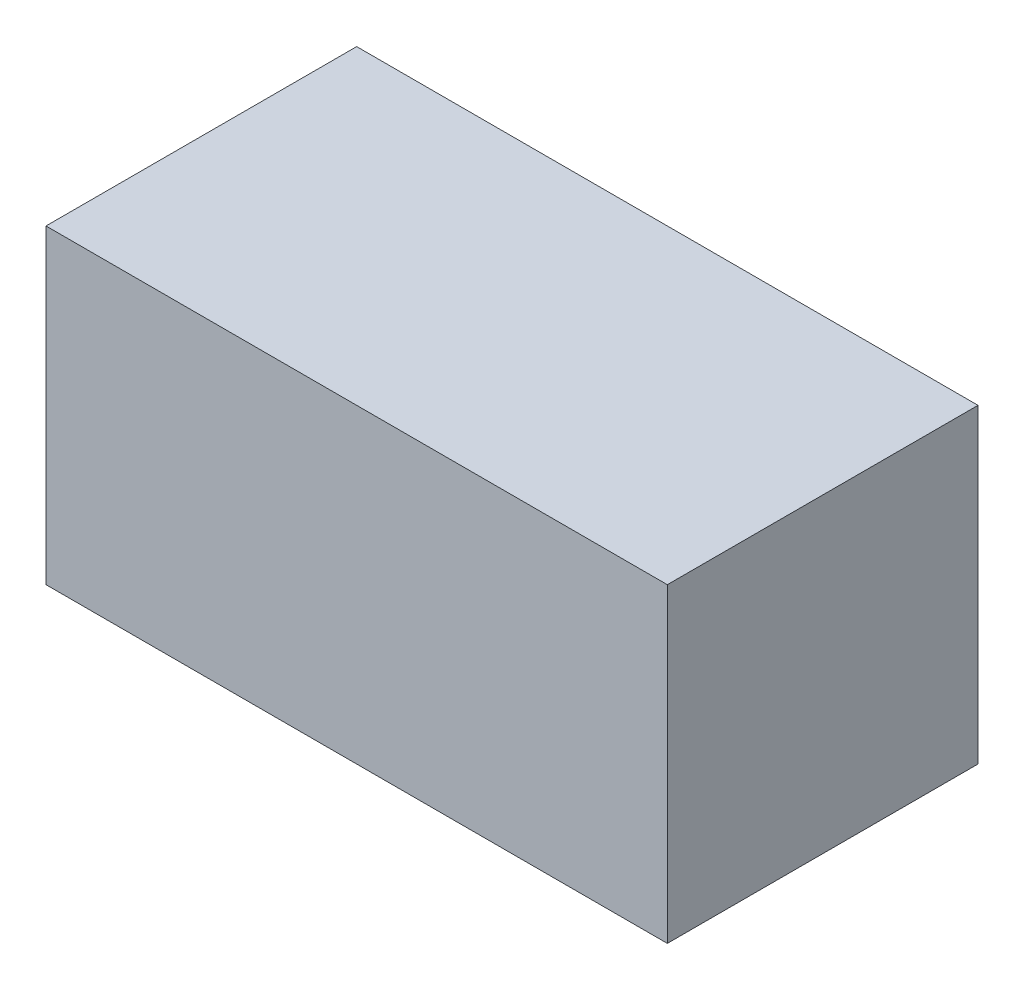
ISO-10303-21;
HEADER;
FILE_DESCRIPTION(('STEP AP214'),'2;1');
FILE_NAME('part.step','',(''),(''),'','','');
FILE_SCHEMA(('AUTOMOTIVE_DESIGN { 1 0 10303 214 1 1 1 1 }'));
ENDSEC;
DATA;
#1=APPLICATION_CONTEXT('core data for automotive mechanical design processes');
#2=APPLICATION_PROTOCOL_DEFINITION('international standard','automotive_design',2000,#1);
#3=PRODUCT_CONTEXT('',#1,'mechanical');
#4=PRODUCT('Part','Part','',(#3));
#5=PRODUCT_RELATED_PRODUCT_CATEGORY('part','',(#4));
#6=PRODUCT_DEFINITION_FORMATION('','',#4);
#7=PRODUCT_DEFINITION_CONTEXT('part definition',#1,'design');
#8=PRODUCT_DEFINITION('design','',#6,#7);
#9=PRODUCT_DEFINITION_SHAPE('','',#8);
#10=(LENGTH_UNIT() NAMED_UNIT(*) SI_UNIT(.MILLI.,.METRE.));
#11=(NAMED_UNIT(*) PLANE_ANGLE_UNIT() SI_UNIT($,.RADIAN.));
#12=(NAMED_UNIT(*) SI_UNIT($,.STERADIAN.) SOLID_ANGLE_UNIT());
#13=UNCERTAINTY_MEASURE_WITH_UNIT(LENGTH_MEASURE(1.E-05),#10,'distance_accuracy_value','');
#14=(GEOMETRIC_REPRESENTATION_CONTEXT(3) GLOBAL_UNCERTAINTY_ASSIGNED_CONTEXT((#13)) GLOBAL_UNIT_ASSIGNED_CONTEXT((#10,
#11,#12)) REPRESENTATION_CONTEXT('',''));
#15=CARTESIAN_POINT('',(0.,0.,0.));
#16=DIRECTION('',(0.,0.,1.));
#17=DIRECTION('',(1.,0.,0.));
#18=AXIS2_PLACEMENT_3D('',#15,#16,#17);
#19=CARTESIAN_POINT('',(42.771982400797,26.2141241906027,50.));
#20=DIRECTION('',(-1.,0.,0.));
#21=DIRECTION('',(0.,-1.,0.));
#22=AXIS2_PLACEMENT_3D('',#19,#20,#21);
#23=PLANE('',#22);
#24=DIRECTION('',(0.,1.,0.));
#25=VECTOR('',#24,1.);
#26=CARTESIAN_POINT('',(42.771982400797,26.2141241906027,0.));
#27=LINE('',#26,#25);
#28=CARTESIAN_POINT('',(42.771982400797,-23.7858758093973,0.));
#29=VERTEX_POINT('',#28);
#30=CARTESIAN_POINT('',(42.771982400797,26.2141241906027,0.));
#31=VERTEX_POINT('',#30);
#32=EDGE_CURVE('E105',#29,#31,#27,.T.);
#33=ORIENTED_EDGE('',*,*,#32,.T.);
#34=DIRECTION('',(0.,0.,-1.));
#35=VECTOR('',#34,1.);
#36=CARTESIAN_POINT('',(42.771982400797,26.2141241906027,50.));
#37=LINE('',#36,#35);
#38=CARTESIAN_POINT('',(42.771982400797,26.2141241906027,50.));
#39=VERTEX_POINT('',#38);
#40=EDGE_CURVE('E11',#39,#31,#37,.T.);
#41=ORIENTED_EDGE('',*,*,#40,.F.);
#42=DIRECTION('',(0.,1.,0.));
#43=VECTOR('',#42,1.);
#44=CARTESIAN_POINT('',(42.771982400797,26.2141241906027,50.));
#45=LINE('',#44,#43);
#46=CARTESIAN_POINT('',(42.771982400797,-23.7858758093973,50.));
#47=VERTEX_POINT('',#46);
#48=EDGE_CURVE('E89',#47,#39,#45,.T.);
#49=ORIENTED_EDGE('',*,*,#48,.F.);
#50=DIRECTION('',(0.,0.,-1.));
#51=VECTOR('',#50,1.);
#52=CARTESIAN_POINT('',(42.771982400797,-23.7858758093973,50.));
#53=LINE('',#52,#51);
#54=EDGE_CURVE('E101',#47,#29,#53,.T.);
#55=ORIENTED_EDGE('',*,*,#54,.T.);
#56=EDGE_LOOP('',(#33,#41,#49,#55));
#57=FACE_BOUND('',#56,.T.);
#58=ADVANCED_FACE('F37',(#57),#23,.F.);
#59=CARTESIAN_POINT('',(-57.228017599203,26.2141241906027,50.));
#60=DIRECTION('',(0.,-1.,0.));
#61=DIRECTION('',(0.,0.,-1.));
#62=AXIS2_PLACEMENT_3D('',#59,#60,#61);
#63=PLANE('',#62);
#64=DIRECTION('',(-1.,0.,0.));
#65=VECTOR('',#64,1.);
#66=CARTESIAN_POINT('',(-57.228017599203,26.2141241906027,0.));
#67=LINE('',#66,#65);
#68=CARTESIAN_POINT('',(-57.228017599203,26.2141241906027,0.));
#69=VERTEX_POINT('',#68);
#70=EDGE_CURVE('E94',#31,#69,#67,.T.);
#71=ORIENTED_EDGE('',*,*,#70,.T.);
#72=DIRECTION('',(0.,0.,-1.));
#73=VECTOR('',#72,1.);
#74=CARTESIAN_POINT('',(-57.228017599203,26.2141241906027,50.));
#75=LINE('',#74,#73);
#76=CARTESIAN_POINT('',(-57.228017599203,26.2141241906027,50.));
#77=VERTEX_POINT('',#76);
#78=EDGE_CURVE('E46',#77,#69,#75,.T.);
#79=ORIENTED_EDGE('',*,*,#78,.F.);
#80=DIRECTION('',(-1.,0.,0.));
#81=VECTOR('',#80,1.);
#82=CARTESIAN_POINT('',(-57.228017599203,26.2141241906027,50.));
#83=LINE('',#82,#81);
#84=EDGE_CURVE('E84',#39,#77,#83,.T.);
#85=ORIENTED_EDGE('',*,*,#84,.F.);
#86=ORIENTED_EDGE('',*,*,#40,.T.);
#87=EDGE_LOOP('',(#71,#79,#85,#86));
#88=FACE_BOUND('',#87,.T.);
#89=ADVANCED_FACE('F93',(#88),#63,.F.);
#90=CARTESIAN_POINT('',(-57.228017599203,26.2141241906027,50.));
#91=DIRECTION('',(1.,0.,0.));
#92=DIRECTION('',(0.,1.,0.));
#93=AXIS2_PLACEMENT_3D('',#90,#91,#92);
#94=PLANE('',#93);
#95=DIRECTION('',(0.,-1.,0.));
#96=VECTOR('',#95,1.);
#97=CARTESIAN_POINT('',(-57.228017599203,26.2141241906027,0.));
#98=LINE('',#97,#96);
#99=CARTESIAN_POINT('',(-57.228017599203,-23.7858758093973,0.));
#100=VERTEX_POINT('',#99);
#101=EDGE_CURVE('E71',#69,#100,#98,.T.);
#102=ORIENTED_EDGE('',*,*,#101,.T.);
#103=DIRECTION('',(0.,0.,-1.));
#104=VECTOR('',#103,1.);
#105=CARTESIAN_POINT('',(-57.228017599203,-23.7858758093973,50.));
#106=LINE('',#105,#104);
#107=CARTESIAN_POINT('',(-57.228017599203,-23.7858758093973,50.));
#108=VERTEX_POINT('',#107);
#109=EDGE_CURVE('E96',#108,#100,#106,.T.);
#110=ORIENTED_EDGE('',*,*,#109,.F.);
#111=DIRECTION('',(0.,-1.,0.));
#112=VECTOR('',#111,1.);
#113=CARTESIAN_POINT('',(-57.228017599203,26.2141241906027,50.));
#114=LINE('',#113,#112);
#115=EDGE_CURVE('E87',#77,#108,#114,.T.);
#116=ORIENTED_EDGE('',*,*,#115,.F.);
#117=ORIENTED_EDGE('',*,*,#78,.T.);
#118=EDGE_LOOP('',(#102,#110,#116,#117));
#119=FACE_BOUND('',#118,.T.);
#120=ADVANCED_FACE('F97',(#119),#94,.F.);
#121=CARTESIAN_POINT('',(-57.228017599203,-23.7858758093973,50.));
#122=DIRECTION('',(0.,1.,0.));
#123=DIRECTION('',(0.,0.,1.));
#124=AXIS2_PLACEMENT_3D('',#121,#122,#123);
#125=PLANE('',#124);
#126=DIRECTION('',(1.,0.,0.));
#127=VECTOR('',#126,1.);
#128=CARTESIAN_POINT('',(-57.228017599203,-23.7858758093973,0.));
#129=LINE('',#128,#127);
#130=EDGE_CURVE('E77',#100,#29,#129,.T.);
#131=ORIENTED_EDGE('',*,*,#130,.T.);
#132=ORIENTED_EDGE('',*,*,#54,.F.);
#133=DIRECTION('',(1.,0.,0.));
#134=VECTOR('',#133,1.);
#135=CARTESIAN_POINT('',(-57.228017599203,-23.7858758093973,50.));
#136=LINE('',#135,#134);
#137=EDGE_CURVE('E54',#108,#47,#136,.T.);
#138=ORIENTED_EDGE('',*,*,#137,.F.);
#139=ORIENTED_EDGE('',*,*,#109,.T.);
#140=EDGE_LOOP('',(#131,#132,#138,#139));
#141=FACE_BOUND('',#140,.T.);
#142=ADVANCED_FACE('F118',(#141),#125,.F.);
#143=CARTESIAN_POINT('',(42.771982400797,-23.7858758093973,50.));
#144=DIRECTION('',(0.,0.,1.));
#145=DIRECTION('',(1.,0.,0.));
#146=AXIS2_PLACEMENT_3D('',#143,#144,#145);
#147=PLANE('',#146);
#148=ORIENTED_EDGE('',*,*,#48,.T.);
#149=ORIENTED_EDGE('',*,*,#84,.T.);
#150=ORIENTED_EDGE('',*,*,#115,.T.);
#151=ORIENTED_EDGE('',*,*,#137,.T.);
#152=EDGE_LOOP('',(#148,#149,#150,#151));
#153=FACE_BOUND('',#152,.T.);
#154=ADVANCED_FACE('F85',(#153),#147,.T.);
#155=CARTESIAN_POINT('',(42.771982400797,-23.7858758093973,0.));
#156=DIRECTION('',(0.,0.,1.));
#157=DIRECTION('',(1.,0.,0.));
#158=AXIS2_PLACEMENT_3D('',#155,#156,#157);
#159=PLANE('',#158);
#160=ORIENTED_EDGE('',*,*,#32,.F.);
#161=ORIENTED_EDGE('',*,*,#130,.F.);
#162=ORIENTED_EDGE('',*,*,#101,.F.);
#163=ORIENTED_EDGE('',*,*,#70,.F.);
#164=EDGE_LOOP('',(#160,#161,#162,#163));
#165=FACE_BOUND('',#164,.T.);
#166=ADVANCED_FACE('F121',(#165),#159,.F.);
#167=CLOSED_SHELL('',(#58,#89,#120,#142,#154,#166));
#168=MANIFOLD_SOLID_BREP('B2',#167);
#169=ADVANCED_BREP_SHAPE_REPRESENTATION('',(#18,#168),#14);
#170=SHAPE_DEFINITION_REPRESENTATION(#9,#169);
ENDSEC;
END-ISO-10303-21;
